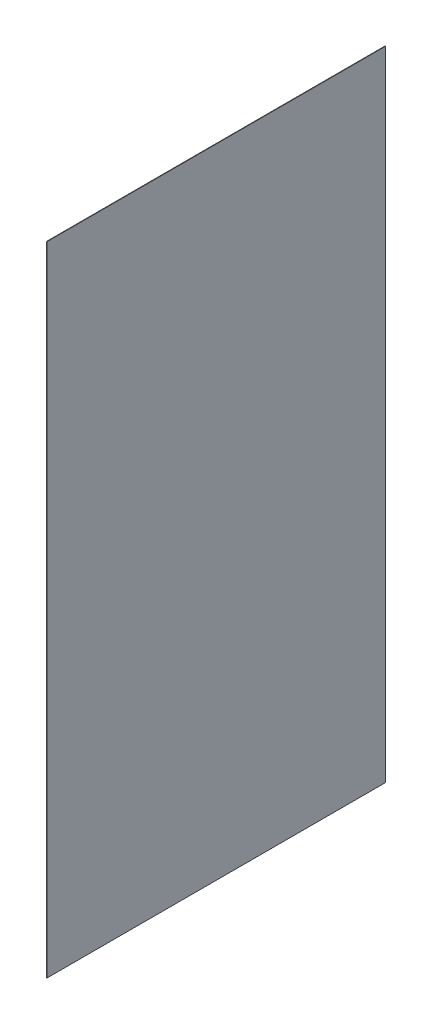
ISO-10303-21;
HEADER;
FILE_DESCRIPTION(('STEP AP214'),'2;1');
FILE_NAME('part.step','',(''),(''),'','','');
FILE_SCHEMA(('AUTOMOTIVE_DESIGN { 1 0 10303 214 1 1 1 1 }'));
ENDSEC;
DATA;
#1=APPLICATION_CONTEXT('core data for automotive mechanical design processes');
#2=APPLICATION_PROTOCOL_DEFINITION('international standard','automotive_design',2000,#1);
#3=PRODUCT_CONTEXT('',#1,'mechanical');
#4=PRODUCT('Part','Part','',(#3));
#5=PRODUCT_RELATED_PRODUCT_CATEGORY('part','',(#4));
#6=PRODUCT_DEFINITION_FORMATION('','',#4);
#7=PRODUCT_DEFINITION_CONTEXT('part definition',#1,'design');
#8=PRODUCT_DEFINITION('design','',#6,#7);
#9=PRODUCT_DEFINITION_SHAPE('','',#8);
#10=(LENGTH_UNIT() NAMED_UNIT(*) SI_UNIT(.MILLI.,.METRE.));
#11=(NAMED_UNIT(*) PLANE_ANGLE_UNIT() SI_UNIT($,.RADIAN.));
#12=(NAMED_UNIT(*) SI_UNIT($,.STERADIAN.) SOLID_ANGLE_UNIT());
#13=UNCERTAINTY_MEASURE_WITH_UNIT(LENGTH_MEASURE(1.E-05),#10,'distance_accuracy_value','');
#14=(GEOMETRIC_REPRESENTATION_CONTEXT(3) GLOBAL_UNCERTAINTY_ASSIGNED_CONTEXT((#13)) GLOBAL_UNIT_ASSIGNED_CONTEXT((#10,
#11,#12)) REPRESENTATION_CONTEXT('',''));
#15=CARTESIAN_POINT('',(0.,0.,0.));
#16=DIRECTION('',(0.,0.,1.));
#17=DIRECTION('',(1.,0.,0.));
#18=AXIS2_PLACEMENT_3D('',#15,#16,#17);
#19=CARTESIAN_POINT('',(1337.5,181.5,-758.5));
#20=DIRECTION('',(-1.,0.,0.));
#21=DIRECTION('',(0.,0.,1.));
#22=AXIS2_PLACEMENT_3D('',#19,#20,#21);
#23=PLANE('',#22);
#24=DIRECTION('',(0.,-1.,0.));
#25=VECTOR('',#24,1.);
#26=CARTESIAN_POINT('',(1337.5,181.5,0.));
#27=LINE('',#26,#25);
#28=CARTESIAN_POINT('',(1337.5,1611.,0.));
#29=VERTEX_POINT('',#28);
#30=CARTESIAN_POINT('',(1337.5,181.5,0.));
#31=VERTEX_POINT('',#30);
#32=EDGE_CURVE('E103',#29,#31,#27,.T.);
#33=ORIENTED_EDGE('',*,*,#32,.F.);
#34=DIRECTION('',(0.,0.,1.));
#35=VECTOR('',#34,1.);
#36=CARTESIAN_POINT('',(1337.5,1611.,-758.5));
#37=LINE('',#36,#35);
#38=CARTESIAN_POINT('',(1337.5,1611.,-758.5));
#39=VERTEX_POINT('',#38);
#40=EDGE_CURVE('E11',#39,#29,#37,.T.);
#41=ORIENTED_EDGE('',*,*,#40,.F.);
#42=DIRECTION('',(0.,-1.,0.));
#43=VECTOR('',#42,1.);
#44=CARTESIAN_POINT('',(1337.5,181.5,-758.5));
#45=LINE('',#44,#43);
#46=CARTESIAN_POINT('',(1337.5,181.5,-758.5));
#47=VERTEX_POINT('',#46);
#48=EDGE_CURVE('E97',#39,#47,#45,.T.);
#49=ORIENTED_EDGE('',*,*,#48,.T.);
#50=DIRECTION('',(0.,0.,1.));
#51=VECTOR('',#50,1.);
#52=CARTESIAN_POINT('',(1337.5,181.5,-758.5));
#53=LINE('',#52,#51);
#54=EDGE_CURVE('E42',#47,#31,#53,.T.);
#55=ORIENTED_EDGE('',*,*,#54,.T.);
#56=EDGE_LOOP('',(#33,#41,#49,#55));
#57=FACE_BOUND('',#56,.T.);
#58=ADVANCED_FACE('F39',(#57),#23,.T.);
#59=CARTESIAN_POINT('',(1337.5,1611.,-758.5));
#60=DIRECTION('',(0.,1.,0.));
#61=DIRECTION('',(0.,0.,1.));
#62=AXIS2_PLACEMENT_3D('',#59,#60,#61);
#63=PLANE('',#62);
#64=DIRECTION('',(-1.,0.,0.));
#65=VECTOR('',#64,1.);
#66=CARTESIAN_POINT('',(1337.5,1611.,0.));
#67=LINE('',#66,#65);
#68=CARTESIAN_POINT('',(1338.5,1611.,0.));
#69=VERTEX_POINT('',#68);
#70=EDGE_CURVE('E99',#69,#29,#67,.T.);
#71=ORIENTED_EDGE('',*,*,#70,.F.);
#72=DIRECTION('',(0.,0.,1.));
#73=VECTOR('',#72,1.);
#74=CARTESIAN_POINT('',(1338.5,1611.,-758.5));
#75=LINE('',#74,#73);
#76=CARTESIAN_POINT('',(1338.5,1611.,-758.5));
#77=VERTEX_POINT('',#76);
#78=EDGE_CURVE('E48',#77,#69,#75,.T.);
#79=ORIENTED_EDGE('',*,*,#78,.F.);
#80=DIRECTION('',(-1.,0.,0.));
#81=VECTOR('',#80,1.);
#82=CARTESIAN_POINT('',(1337.5,1611.,-758.5));
#83=LINE('',#82,#81);
#84=EDGE_CURVE('E94',#77,#39,#83,.T.);
#85=ORIENTED_EDGE('',*,*,#84,.T.);
#86=ORIENTED_EDGE('',*,*,#40,.T.);
#87=EDGE_LOOP('',(#71,#79,#85,#86));
#88=FACE_BOUND('',#87,.T.);
#89=ADVANCED_FACE('F113',(#88),#63,.T.);
#90=CARTESIAN_POINT('',(1338.5,181.5,-758.5));
#91=DIRECTION('',(1.,0.,0.));
#92=DIRECTION('',(0.,0.,-1.));
#93=AXIS2_PLACEMENT_3D('',#90,#91,#92);
#94=PLANE('',#93);
#95=DIRECTION('',(0.,1.,0.));
#96=VECTOR('',#95,1.);
#97=CARTESIAN_POINT('',(1338.5,181.5,0.));
#98=LINE('',#97,#96);
#99=CARTESIAN_POINT('',(1338.5,181.5,0.));
#100=VERTEX_POINT('',#99);
#101=EDGE_CURVE('E89',#100,#69,#98,.T.);
#102=ORIENTED_EDGE('',*,*,#101,.F.);
#103=DIRECTION('',(0.,0.,1.));
#104=VECTOR('',#103,1.);
#105=CARTESIAN_POINT('',(1338.5,181.5,-758.5));
#106=LINE('',#105,#104);
#107=CARTESIAN_POINT('',(1338.5,181.5,-758.5));
#108=VERTEX_POINT('',#107);
#109=EDGE_CURVE('E84',#108,#100,#106,.T.);
#110=ORIENTED_EDGE('',*,*,#109,.F.);
#111=DIRECTION('',(0.,1.,0.));
#112=VECTOR('',#111,1.);
#113=CARTESIAN_POINT('',(1338.5,181.5,-758.5));
#114=LINE('',#113,#112);
#115=EDGE_CURVE('E87',#108,#77,#114,.T.);
#116=ORIENTED_EDGE('',*,*,#115,.T.);
#117=ORIENTED_EDGE('',*,*,#78,.T.);
#118=EDGE_LOOP('',(#102,#110,#116,#117));
#119=FACE_BOUND('',#118,.T.);
#120=ADVANCED_FACE('F86',(#119),#94,.T.);
#121=CARTESIAN_POINT('',(1337.5,181.5,-758.5));
#122=DIRECTION('',(0.,-1.,0.));
#123=DIRECTION('',(0.,0.,-1.));
#124=AXIS2_PLACEMENT_3D('',#121,#122,#123);
#125=PLANE('',#124);
#126=DIRECTION('',(1.,0.,0.));
#127=VECTOR('',#126,1.);
#128=CARTESIAN_POINT('',(1337.5,181.5,0.));
#129=LINE('',#128,#127);
#130=EDGE_CURVE('E106',#31,#100,#129,.T.);
#131=ORIENTED_EDGE('',*,*,#130,.F.);
#132=ORIENTED_EDGE('',*,*,#54,.F.);
#133=DIRECTION('',(1.,0.,0.));
#134=VECTOR('',#133,1.);
#135=CARTESIAN_POINT('',(1337.5,181.5,-758.5));
#136=LINE('',#135,#134);
#137=EDGE_CURVE('E93',#47,#108,#136,.T.);
#138=ORIENTED_EDGE('',*,*,#137,.T.);
#139=ORIENTED_EDGE('',*,*,#109,.T.);
#140=EDGE_LOOP('',(#131,#132,#138,#139));
#141=FACE_BOUND('',#140,.T.);
#142=ADVANCED_FACE('F96',(#141),#125,.T.);
#143=CARTESIAN_POINT('',(0.,0.,-758.5));
#144=DIRECTION('',(0.,0.,-1.));
#145=DIRECTION('',(-1.,0.,0.));
#146=AXIS2_PLACEMENT_3D('',#143,#144,#145);
#147=PLANE('',#146);
#148=ORIENTED_EDGE('',*,*,#48,.F.);
#149=ORIENTED_EDGE('',*,*,#84,.F.);
#150=ORIENTED_EDGE('',*,*,#115,.F.);
#151=ORIENTED_EDGE('',*,*,#137,.F.);
#152=EDGE_LOOP('',(#148,#149,#150,#151));
#153=FACE_BOUND('',#152,.T.);
#154=ADVANCED_FACE('F92',(#153),#147,.T.);
#155=CARTESIAN_POINT('',(0.,0.,0.));
#156=DIRECTION('',(0.,0.,-1.));
#157=DIRECTION('',(-1.,0.,0.));
#158=AXIS2_PLACEMENT_3D('',#155,#156,#157);
#159=PLANE('',#158);
#160=ORIENTED_EDGE('',*,*,#32,.T.);
#161=ORIENTED_EDGE('',*,*,#130,.T.);
#162=ORIENTED_EDGE('',*,*,#101,.T.);
#163=ORIENTED_EDGE('',*,*,#70,.T.);
#164=EDGE_LOOP('',(#160,#161,#162,#163));
#165=FACE_BOUND('',#164,.T.);
#166=ADVANCED_FACE('F112',(#165),#159,.F.);
#167=CLOSED_SHELL('',(#58,#89,#120,#142,#154,#166));
#168=MANIFOLD_SOLID_BREP('B2',#167);
#169=ADVANCED_BREP_SHAPE_REPRESENTATION('',(#18,#168),#14);
#170=SHAPE_DEFINITION_REPRESENTATION(#9,#169);
ENDSEC;
END-ISO-10303-21;
